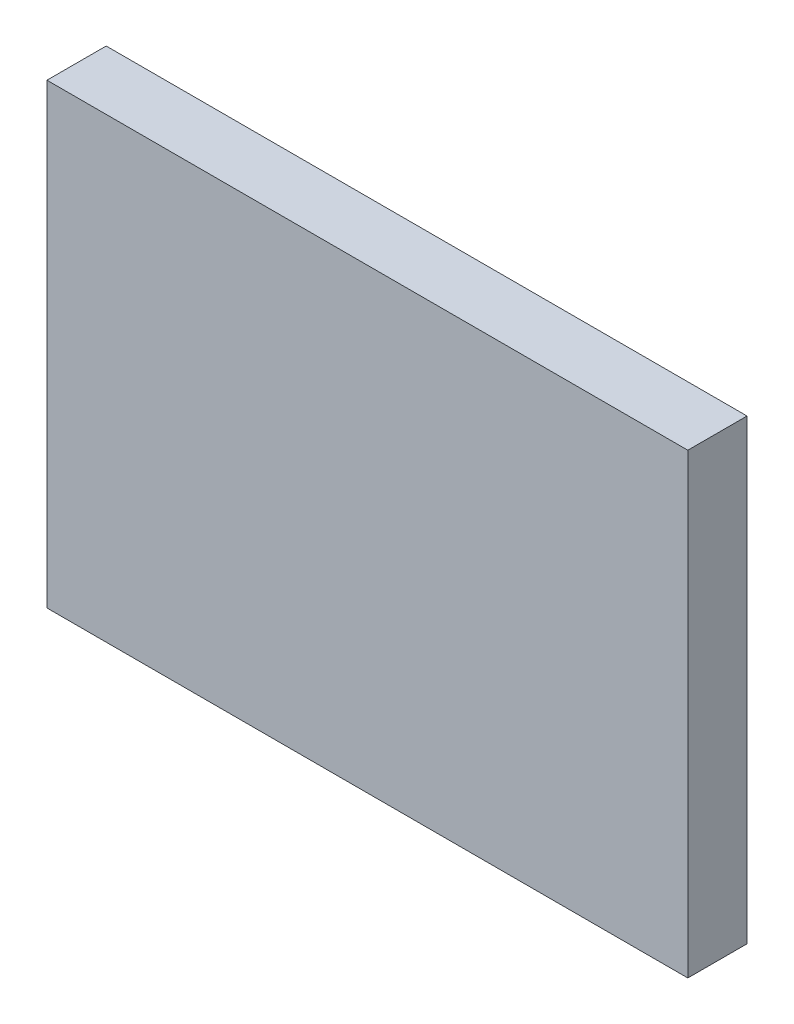
ISO-10303-21;
HEADER;
FILE_DESCRIPTION(('STEP AP214'),'2;1');
FILE_NAME('part.step','',(''),(''),'','','');
FILE_SCHEMA(('AUTOMOTIVE_DESIGN { 1 0 10303 214 1 1 1 1 }'));
ENDSEC;
DATA;
#1=APPLICATION_CONTEXT('core data for automotive mechanical design processes');
#2=APPLICATION_PROTOCOL_DEFINITION('international standard','automotive_design',2000,#1);
#3=PRODUCT_CONTEXT('',#1,'mechanical');
#4=PRODUCT('Part','Part','',(#3));
#5=PRODUCT_RELATED_PRODUCT_CATEGORY('part','',(#4));
#6=PRODUCT_DEFINITION_FORMATION('','',#4);
#7=PRODUCT_DEFINITION_CONTEXT('part definition',#1,'design');
#8=PRODUCT_DEFINITION('design','',#6,#7);
#9=PRODUCT_DEFINITION_SHAPE('','',#8);
#10=(LENGTH_UNIT() NAMED_UNIT(*) SI_UNIT(.MILLI.,.METRE.));
#11=(NAMED_UNIT(*) PLANE_ANGLE_UNIT() SI_UNIT($,.RADIAN.));
#12=(NAMED_UNIT(*) SI_UNIT($,.STERADIAN.) SOLID_ANGLE_UNIT());
#13=UNCERTAINTY_MEASURE_WITH_UNIT(LENGTH_MEASURE(1.E-05),#10,'distance_accuracy_value','');
#14=(GEOMETRIC_REPRESENTATION_CONTEXT(3) GLOBAL_UNCERTAINTY_ASSIGNED_CONTEXT((#13)) GLOBAL_UNIT_ASSIGNED_CONTEXT((#10,
#11,#12)) REPRESENTATION_CONTEXT('',''));
#15=CARTESIAN_POINT('',(0.,0.,0.));
#16=DIRECTION('',(0.,0.,1.));
#17=DIRECTION('',(1.,0.,0.));
#18=AXIS2_PLACEMENT_3D('',#15,#16,#17);
#19=CARTESIAN_POINT('',(0.,49.,6.35));
#20=DIRECTION('',(0.,-1.,0.));
#21=DIRECTION('',(0.,0.,-1.));
#22=AXIS2_PLACEMENT_3D('',#19,#20,#21);
#23=PLANE('',#22);
#24=DIRECTION('',(-1.,0.,0.));
#25=VECTOR('',#24,1.);
#26=CARTESIAN_POINT('',(0.,49.,0.));
#27=LINE('',#26,#25);
#28=CARTESIAN_POINT('',(0.,49.,0.));
#29=VERTEX_POINT('',#28);
#30=CARTESIAN_POINT('',(-68.7,49.,0.));
#31=VERTEX_POINT('',#30);
#32=EDGE_CURVE('E107',#29,#31,#27,.T.);
#33=ORIENTED_EDGE('',*,*,#32,.T.);
#34=DIRECTION('',(0.,0.,-1.));
#35=VECTOR('',#34,1.);
#36=CARTESIAN_POINT('',(-68.7,49.,6.35));
#37=LINE('',#36,#35);
#38=CARTESIAN_POINT('',(-68.7,49.,6.35));
#39=VERTEX_POINT('',#38);
#40=EDGE_CURVE('E11',#39,#31,#37,.T.);
#41=ORIENTED_EDGE('',*,*,#40,.F.);
#42=DIRECTION('',(-1.,0.,0.));
#43=VECTOR('',#42,1.);
#44=CARTESIAN_POINT('',(0.,49.,6.35));
#45=LINE('',#44,#43);
#46=CARTESIAN_POINT('',(0.,49.,6.35));
#47=VERTEX_POINT('',#46);
#48=EDGE_CURVE('E91',#47,#39,#45,.T.);
#49=ORIENTED_EDGE('',*,*,#48,.F.);
#50=DIRECTION('',(0.,0.,-1.));
#51=VECTOR('',#50,1.);
#52=CARTESIAN_POINT('',(0.,49.,6.35));
#53=LINE('',#52,#51);
#54=EDGE_CURVE('E103',#47,#29,#53,.T.);
#55=ORIENTED_EDGE('',*,*,#54,.T.);
#56=EDGE_LOOP('',(#33,#41,#49,#55));
#57=FACE_BOUND('',#56,.T.);
#58=ADVANCED_FACE('F39',(#57),#23,.F.);
#59=CARTESIAN_POINT('',(-68.7,49.,6.35));
#60=DIRECTION('',(1.,0.,0.));
#61=DIRECTION('',(0.,0.,-1.));
#62=AXIS2_PLACEMENT_3D('',#59,#60,#61);
#63=PLANE('',#62);
#64=DIRECTION('',(0.,-1.,0.));
#65=VECTOR('',#64,1.);
#66=CARTESIAN_POINT('',(-68.7,49.,0.));
#67=LINE('',#66,#65);
#68=CARTESIAN_POINT('',(-68.7,0.,0.));
#69=VERTEX_POINT('',#68);
#70=EDGE_CURVE('E96',#31,#69,#67,.T.);
#71=ORIENTED_EDGE('',*,*,#70,.T.);
#72=DIRECTION('',(0.,0.,-1.));
#73=VECTOR('',#72,1.);
#74=CARTESIAN_POINT('',(-68.7,0.,6.35));
#75=LINE('',#74,#73);
#76=CARTESIAN_POINT('',(-68.7,0.,6.35));
#77=VERTEX_POINT('',#76);
#78=EDGE_CURVE('E48',#77,#69,#75,.T.);
#79=ORIENTED_EDGE('',*,*,#78,.F.);
#80=DIRECTION('',(0.,-1.,0.));
#81=VECTOR('',#80,1.);
#82=CARTESIAN_POINT('',(-68.7,49.,6.35));
#83=LINE('',#82,#81);
#84=EDGE_CURVE('E86',#39,#77,#83,.T.);
#85=ORIENTED_EDGE('',*,*,#84,.F.);
#86=ORIENTED_EDGE('',*,*,#40,.T.);
#87=EDGE_LOOP('',(#71,#79,#85,#86));
#88=FACE_BOUND('',#87,.T.);
#89=ADVANCED_FACE('F95',(#88),#63,.F.);
#90=CARTESIAN_POINT('',(-68.7,0.,6.35));
#91=DIRECTION('',(0.,1.,0.));
#92=DIRECTION('',(0.,0.,1.));
#93=AXIS2_PLACEMENT_3D('',#90,#91,#92);
#94=PLANE('',#93);
#95=DIRECTION('',(1.,0.,0.));
#96=VECTOR('',#95,1.);
#97=CARTESIAN_POINT('',(-68.7,0.,0.));
#98=LINE('',#97,#96);
#99=CARTESIAN_POINT('',(0.,0.,0.));
#100=VERTEX_POINT('',#99);
#101=EDGE_CURVE('E73',#69,#100,#98,.T.);
#102=ORIENTED_EDGE('',*,*,#101,.T.);
#103=DIRECTION('',(0.,0.,-1.));
#104=VECTOR('',#103,1.);
#105=CARTESIAN_POINT('',(0.,0.,6.35));
#106=LINE('',#105,#104);
#107=CARTESIAN_POINT('',(0.,0.,6.35));
#108=VERTEX_POINT('',#107);
#109=EDGE_CURVE('E98',#108,#100,#106,.T.);
#110=ORIENTED_EDGE('',*,*,#109,.F.);
#111=DIRECTION('',(1.,0.,0.));
#112=VECTOR('',#111,1.);
#113=CARTESIAN_POINT('',(-68.7,0.,6.35));
#114=LINE('',#113,#112);
#115=EDGE_CURVE('E89',#77,#108,#114,.T.);
#116=ORIENTED_EDGE('',*,*,#115,.F.);
#117=ORIENTED_EDGE('',*,*,#78,.T.);
#118=EDGE_LOOP('',(#102,#110,#116,#117));
#119=FACE_BOUND('',#118,.T.);
#120=ADVANCED_FACE('F99',(#119),#94,.F.);
#121=CARTESIAN_POINT('',(0.,0.,6.35));
#122=DIRECTION('',(-1.,0.,0.));
#123=DIRECTION('',(0.,-1.,0.));
#124=AXIS2_PLACEMENT_3D('',#121,#122,#123);
#125=PLANE('',#124);
#126=DIRECTION('',(0.,1.,0.));
#127=VECTOR('',#126,1.);
#128=CARTESIAN_POINT('',(0.,0.,0.));
#129=LINE('',#128,#127);
#130=EDGE_CURVE('E79',#100,#29,#129,.T.);
#131=ORIENTED_EDGE('',*,*,#130,.T.);
#132=ORIENTED_EDGE('',*,*,#54,.F.);
#133=DIRECTION('',(0.,1.,0.));
#134=VECTOR('',#133,1.);
#135=CARTESIAN_POINT('',(0.,0.,6.35));
#136=LINE('',#135,#134);
#137=EDGE_CURVE('E56',#108,#47,#136,.T.);
#138=ORIENTED_EDGE('',*,*,#137,.F.);
#139=ORIENTED_EDGE('',*,*,#109,.T.);
#140=EDGE_LOOP('',(#131,#132,#138,#139));
#141=FACE_BOUND('',#140,.T.);
#142=ADVANCED_FACE('F120',(#141),#125,.F.);
#143=CARTESIAN_POINT('',(0.,0.,6.35));
#144=DIRECTION('',(0.,0.,1.));
#145=DIRECTION('',(1.,0.,0.));
#146=AXIS2_PLACEMENT_3D('',#143,#144,#145);
#147=PLANE('',#146);
#148=ORIENTED_EDGE('',*,*,#48,.T.);
#149=ORIENTED_EDGE('',*,*,#84,.T.);
#150=ORIENTED_EDGE('',*,*,#115,.T.);
#151=ORIENTED_EDGE('',*,*,#137,.T.);
#152=EDGE_LOOP('',(#148,#149,#150,#151));
#153=FACE_BOUND('',#152,.T.);
#154=ADVANCED_FACE('F87',(#153),#147,.T.);
#155=CARTESIAN_POINT('',(0.,0.,0.));
#156=DIRECTION('',(0.,0.,1.));
#157=DIRECTION('',(1.,0.,0.));
#158=AXIS2_PLACEMENT_3D('',#155,#156,#157);
#159=PLANE('',#158);
#160=ORIENTED_EDGE('',*,*,#32,.F.);
#161=ORIENTED_EDGE('',*,*,#130,.F.);
#162=ORIENTED_EDGE('',*,*,#101,.F.);
#163=ORIENTED_EDGE('',*,*,#70,.F.);
#164=EDGE_LOOP('',(#160,#161,#162,#163));
#165=FACE_BOUND('',#164,.T.);
#166=ADVANCED_FACE('F123',(#165),#159,.F.);
#167=CLOSED_SHELL('',(#58,#89,#120,#142,#154,#166));
#168=MANIFOLD_SOLID_BREP('B2',#167);
#169=ADVANCED_BREP_SHAPE_REPRESENTATION('',(#18,#168),#14);
#170=SHAPE_DEFINITION_REPRESENTATION(#9,#169);
ENDSEC;
END-ISO-10303-21;
